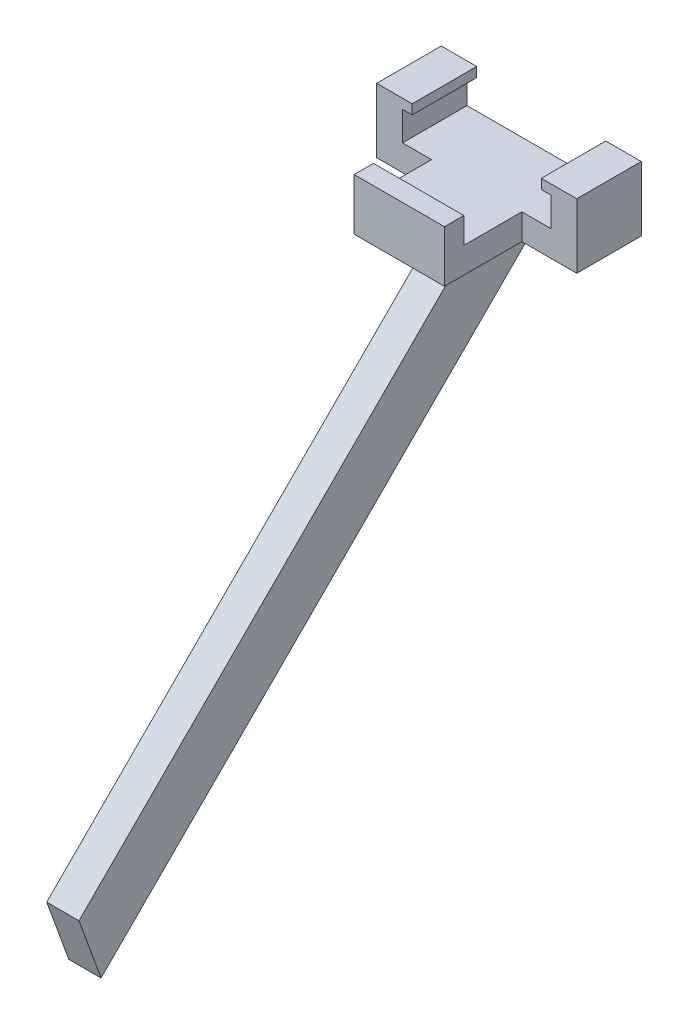
ISO-10303-21;
HEADER;
FILE_DESCRIPTION(('STEP AP214'),'2;1');
FILE_NAME('part.step','',(''),(''),'','','');
FILE_SCHEMA(('AUTOMOTIVE_DESIGN { 1 0 10303 214 1 1 1 1 }'));
ENDSEC;
DATA;
#1=APPLICATION_CONTEXT('core data for automotive mechanical design processes');
#2=APPLICATION_PROTOCOL_DEFINITION('international standard','automotive_design',2000,#1);
#3=PRODUCT_CONTEXT('',#1,'mechanical');
#4=PRODUCT('Part','Part','',(#3));
#5=PRODUCT_RELATED_PRODUCT_CATEGORY('part','',(#4));
#6=PRODUCT_DEFINITION_FORMATION('','',#4);
#7=PRODUCT_DEFINITION_CONTEXT('part definition',#1,'design');
#8=PRODUCT_DEFINITION('design','',#6,#7);
#9=PRODUCT_DEFINITION_SHAPE('','',#8);
#10=(LENGTH_UNIT() NAMED_UNIT(*) SI_UNIT(.MILLI.,.METRE.));
#11=(NAMED_UNIT(*) PLANE_ANGLE_UNIT() SI_UNIT($,.RADIAN.));
#12=(NAMED_UNIT(*) SI_UNIT($,.STERADIAN.) SOLID_ANGLE_UNIT());
#13=UNCERTAINTY_MEASURE_WITH_UNIT(LENGTH_MEASURE(1.E-05),#10,'distance_accuracy_value','');
#14=(GEOMETRIC_REPRESENTATION_CONTEXT(3) GLOBAL_UNCERTAINTY_ASSIGNED_CONTEXT((#13)) GLOBAL_UNIT_ASSIGNED_CONTEXT((#10,
#11,#12)) REPRESENTATION_CONTEXT('',''));
#15=CARTESIAN_POINT('',(0.,0.,0.));
#16=DIRECTION('',(0.,0.,1.));
#17=DIRECTION('',(1.,0.,0.));
#18=AXIS2_PLACEMENT_3D('',#15,#16,#17);
#19=CARTESIAN_POINT('',(0.,0.,10.));
#20=DIRECTION('',(0.,0.,1.));
#21=DIRECTION('',(1.,0.,0.));
#22=AXIS2_PLACEMENT_3D('',#19,#20,#21);
#23=PLANE('',#22);
#24=DIRECTION('',(1.,0.,0.));
#25=VECTOR('',#24,1.);
#26=CARTESIAN_POINT('',(0.,-9.,10.));
#27=LINE('',#26,#25);
#28=CARTESIAN_POINT('',(0.,-9.,10.));
#29=VERTEX_POINT('',#28);
#30=CARTESIAN_POINT('',(8.5,-9.,10.));
#31=VERTEX_POINT('',#30);
#32=EDGE_CURVE('E271',#29,#31,#27,.T.);
#33=ORIENTED_EDGE('',*,*,#32,.T.);
#34=DIRECTION('',(0.,-1.,0.));
#35=VECTOR('',#34,1.);
#36=CARTESIAN_POINT('',(8.5,-5.,10.));
#37=LINE('',#36,#35);
#38=CARTESIAN_POINT('',(8.5,-5.,10.));
#39=VERTEX_POINT('',#38);
#40=EDGE_CURVE('E58',#39,#31,#37,.T.);
#41=ORIENTED_EDGE('',*,*,#40,.F.);
#42=DIRECTION('',(-1.,0.,0.));
#43=VECTOR('',#42,1.);
#44=CARTESIAN_POINT('',(0.,-5.,10.));
#45=LINE('',#44,#43);
#46=CARTESIAN_POINT('',(4.,-5.,10.));
#47=VERTEX_POINT('',#46);
#48=EDGE_CURVE('E284',#39,#47,#45,.T.);
#49=ORIENTED_EDGE('',*,*,#48,.T.);
#50=DIRECTION('',(0.,1.,0.));
#51=VECTOR('',#50,1.);
#52=CARTESIAN_POINT('',(4.,0.,10.));
#53=LINE('',#52,#51);
#54=CARTESIAN_POINT('',(4.,-0.500000000000001,10.));
#55=VERTEX_POINT('',#54);
#56=EDGE_CURVE('E286',#47,#55,#53,.T.);
#57=ORIENTED_EDGE('',*,*,#56,.T.);
#58=DIRECTION('',(-1.,0.,0.));
#59=VECTOR('',#58,1.);
#60=CARTESIAN_POINT('',(0.,-0.500000000000001,10.));
#61=LINE('',#60,#59);
#62=CARTESIAN_POINT('',(5.5,-0.5,10.));
#63=VERTEX_POINT('',#62);
#64=EDGE_CURVE('E288',#63,#55,#61,.T.);
#65=ORIENTED_EDGE('',*,*,#64,.F.);
#66=DIRECTION('',(0.,-1.,0.));
#67=VECTOR('',#66,1.);
#68=CARTESIAN_POINT('',(5.5,0.,10.));
#69=LINE('',#68,#67);
#70=CARTESIAN_POINT('',(5.5,1.,10.));
#71=VERTEX_POINT('',#70);
#72=EDGE_CURVE('E291',#71,#63,#69,.T.);
#73=ORIENTED_EDGE('',*,*,#72,.F.);
#74=DIRECTION('',(1.,0.,0.));
#75=VECTOR('',#74,1.);
#76=CARTESIAN_POINT('',(0.,1.,10.));
#77=LINE('',#76,#75);
#78=CARTESIAN_POINT('',(0.,1.,10.));
#79=VERTEX_POINT('',#78);
#80=EDGE_CURVE('E294',#79,#71,#77,.T.);
#81=ORIENTED_EDGE('',*,*,#80,.F.);
#82=DIRECTION('',(0.,1.,0.));
#83=VECTOR('',#82,1.);
#84=CARTESIAN_POINT('',(0.,0.,10.));
#85=LINE('',#84,#83);
#86=EDGE_CURVE('E297',#29,#79,#85,.T.);
#87=ORIENTED_EDGE('',*,*,#86,.F.);
#88=EDGE_LOOP('',(#33,#41,#49,#57,#65,#73,#81,#87));
#89=FACE_BOUND('',#88,.T.);
#90=ADVANCED_FACE('F41',(#89),#23,.T.);
#91=CARTESIAN_POINT('',(27.,-5.,10.));
#92=VERTEX_POINT('',#91);
#93=CARTESIAN_POINT('',(22.5,-5.,10.));
#94=VERTEX_POINT('',#93);
#95=EDGE_CURVE('E66',#92,#94,#45,.T.);
#96=ORIENTED_EDGE('',*,*,#95,.T.);
#97=DIRECTION('',(0.,-1.,0.));
#98=VECTOR('',#97,1.);
#99=CARTESIAN_POINT('',(22.5,-5.,10.));
#100=LINE('',#99,#98);
#101=CARTESIAN_POINT('',(22.5,-9.,10.));
#102=VERTEX_POINT('',#101);
#103=EDGE_CURVE('E237',#94,#102,#100,.T.);
#104=ORIENTED_EDGE('',*,*,#103,.T.);
#105=CARTESIAN_POINT('',(31.,-9.,10.));
#106=VERTEX_POINT('',#105);
#107=EDGE_CURVE('E274',#102,#106,#27,.T.);
#108=ORIENTED_EDGE('',*,*,#107,.T.);
#109=DIRECTION('',(0.,1.,0.));
#110=VECTOR('',#109,1.);
#111=CARTESIAN_POINT('',(31.,0.,10.));
#112=LINE('',#111,#110);
#113=CARTESIAN_POINT('',(31.,1.,10.));
#114=VERTEX_POINT('',#113);
#115=EDGE_CURVE('E273',#106,#114,#112,.T.);
#116=ORIENTED_EDGE('',*,*,#115,.T.);
#117=DIRECTION('',(-1.,0.,0.));
#118=VECTOR('',#117,1.);
#119=CARTESIAN_POINT('',(0.,1.,10.));
#120=LINE('',#119,#118);
#121=CARTESIAN_POINT('',(25.5,1.,10.));
#122=VERTEX_POINT('',#121);
#123=EDGE_CURVE('E276',#114,#122,#120,.T.);
#124=ORIENTED_EDGE('',*,*,#123,.T.);
#125=DIRECTION('',(0.,-1.,0.));
#126=VECTOR('',#125,1.);
#127=CARTESIAN_POINT('',(25.5,0.,10.));
#128=LINE('',#127,#126);
#129=CARTESIAN_POINT('',(25.5,-0.5,10.));
#130=VERTEX_POINT('',#129);
#131=EDGE_CURVE('E278',#122,#130,#128,.T.);
#132=ORIENTED_EDGE('',*,*,#131,.T.);
#133=DIRECTION('',(1.,0.,0.));
#134=VECTOR('',#133,1.);
#135=CARTESIAN_POINT('',(0.,-0.499999999999997,10.));
#136=LINE('',#135,#134);
#137=CARTESIAN_POINT('',(27.,-0.500000000000001,10.));
#138=VERTEX_POINT('',#137);
#139=EDGE_CURVE('E280',#130,#138,#136,.T.);
#140=ORIENTED_EDGE('',*,*,#139,.T.);
#141=DIRECTION('',(0.,-1.,0.));
#142=VECTOR('',#141,1.);
#143=CARTESIAN_POINT('',(27.,0.,10.));
#144=LINE('',#143,#142);
#145=EDGE_CURVE('E282',#138,#92,#144,.T.);
#146=ORIENTED_EDGE('',*,*,#145,.T.);
#147=EDGE_LOOP('',(#96,#104,#108,#116,#124,#132,#140,#146));
#148=FACE_BOUND('',#147,.T.);
#149=ADVANCED_FACE('F380',(#148),#23,.T.);
#150=CARTESIAN_POINT('',(0.,-9.,10.));
#151=DIRECTION('',(0.,1.,0.));
#152=DIRECTION('',(0.,0.,1.));
#153=AXIS2_PLACEMENT_3D('',#150,#151,#152);
#154=PLANE('',#153);
#155=ORIENTED_EDGE('',*,*,#107,.F.);
#156=DIRECTION('',(0.,0.,-1.));
#157=VECTOR('',#156,1.);
#158=CARTESIAN_POINT('',(22.5,-9.,19.));
#159=LINE('',#158,#157);
#160=CARTESIAN_POINT('',(22.5,-9.,22.));
#161=VERTEX_POINT('',#160);
#162=EDGE_CURVE('E200',#161,#102,#159,.T.);
#163=ORIENTED_EDGE('',*,*,#162,.F.);
#164=DIRECTION('',(1.,0.,0.));
#165=VECTOR('',#164,1.);
#166=CARTESIAN_POINT('',(8.5,-9.,22.));
#167=LINE('',#166,#165);
#168=CARTESIAN_POINT('',(8.5,-9.,22.));
#169=VERTEX_POINT('',#168);
#170=EDGE_CURVE('E204',#169,#161,#167,.T.);
#171=ORIENTED_EDGE('',*,*,#170,.F.);
#172=DIRECTION('',(0.,0.,1.));
#173=VECTOR('',#172,1.);
#174=CARTESIAN_POINT('',(8.5,-9.,10.));
#175=LINE('',#174,#173);
#176=EDGE_CURVE('E191',#31,#169,#175,.T.);
#177=ORIENTED_EDGE('',*,*,#176,.F.);
#178=ORIENTED_EDGE('',*,*,#32,.F.);
#179=DIRECTION('',(0.,0.,-1.));
#180=VECTOR('',#179,1.);
#181=CARTESIAN_POINT('',(0.,-9.,10.));
#182=LINE('',#181,#180);
#183=CARTESIAN_POINT('',(0.,-9.,0.));
#184=VERTEX_POINT('',#183);
#185=EDGE_CURVE('E300',#29,#184,#182,.T.);
#186=ORIENTED_EDGE('',*,*,#185,.T.);
#187=DIRECTION('',(1.,0.,0.));
#188=VECTOR('',#187,1.);
#189=CARTESIAN_POINT('',(0.,-9.,0.));
#190=LINE('',#189,#188);
#191=CARTESIAN_POINT('',(13.,-9.,0.));
#192=VERTEX_POINT('',#191);
#193=EDGE_CURVE('E301',#184,#192,#190,.T.);
#194=ORIENTED_EDGE('',*,*,#193,.T.);
#195=DIRECTION('',(0.,0.,-1.));
#196=VECTOR('',#195,1.);
#197=CARTESIAN_POINT('',(13.,-9.,0.));
#198=LINE('',#197,#196);
#199=CARTESIAN_POINT('',(13.,-9.,12.8171276411148));
#200=VERTEX_POINT('',#199);
#201=EDGE_CURVE('E50',#200,#192,#198,.T.);
#202=ORIENTED_EDGE('',*,*,#201,.F.);
#203=DIRECTION('',(1.,0.,0.));
#204=VECTOR('',#203,1.);
#205=CARTESIAN_POINT('',(13.,-9.,12.8171276411148));
#206=LINE('',#205,#204);
#207=CARTESIAN_POINT('',(18.,-9.,12.8171276411148));
#208=VERTEX_POINT('',#207);
#209=EDGE_CURVE('E252',#200,#208,#206,.T.);
#210=ORIENTED_EDGE('',*,*,#209,.T.);
#211=DIRECTION('',(0.,0.,-1.));
#212=VECTOR('',#211,1.);
#213=CARTESIAN_POINT('',(18.,-9.,0.));
#214=LINE('',#213,#212);
#215=CARTESIAN_POINT('',(18.,-9.,0.));
#216=VERTEX_POINT('',#215);
#217=EDGE_CURVE('E11',#208,#216,#214,.T.);
#218=ORIENTED_EDGE('',*,*,#217,.T.);
#219=CARTESIAN_POINT('',(31.,-9.,0.));
#220=VERTEX_POINT('',#219);
#221=EDGE_CURVE('E270',#216,#220,#190,.T.);
#222=ORIENTED_EDGE('',*,*,#221,.T.);
#223=DIRECTION('',(0.,0.,-1.));
#224=VECTOR('',#223,1.);
#225=CARTESIAN_POINT('',(31.,-9.,10.));
#226=LINE('',#225,#224);
#227=EDGE_CURVE('E45',#106,#220,#226,.T.);
#228=ORIENTED_EDGE('',*,*,#227,.F.);
#229=EDGE_LOOP('',(#155,#163,#171,#177,#178,#186,#194,#202,#210,#218,#222,#228));
#230=FACE_BOUND('',#229,.T.);
#231=ADVANCED_FACE('F43',(#230),#154,.F.);
#232=CARTESIAN_POINT('',(31.,0.,10.));
#233=DIRECTION('',(-1.,0.,0.));
#234=DIRECTION('',(0.,-1.,0.));
#235=AXIS2_PLACEMENT_3D('',#232,#233,#234);
#236=PLANE('',#235);
#237=DIRECTION('',(0.,1.,0.));
#238=VECTOR('',#237,1.);
#239=CARTESIAN_POINT('',(31.,0.,0.));
#240=LINE('',#239,#238);
#241=CARTESIAN_POINT('',(31.,1.,0.));
#242=VERTEX_POINT('',#241);
#243=EDGE_CURVE('E303',#220,#242,#240,.T.);
#244=ORIENTED_EDGE('',*,*,#243,.T.);
#245=DIRECTION('',(0.,0.,-1.));
#246=VECTOR('',#245,1.);
#247=CARTESIAN_POINT('',(31.,1.,10.));
#248=LINE('',#247,#246);
#249=EDGE_CURVE('E353',#114,#242,#248,.T.);
#250=ORIENTED_EDGE('',*,*,#249,.F.);
#251=ORIENTED_EDGE('',*,*,#115,.F.);
#252=ORIENTED_EDGE('',*,*,#227,.T.);
#253=EDGE_LOOP('',(#244,#250,#251,#252));
#254=FACE_BOUND('',#253,.T.);
#255=ADVANCED_FACE('F363',(#254),#236,.F.);
#256=CARTESIAN_POINT('',(0.,1.,10.));
#257=DIRECTION('',(0.,-1.,0.));
#258=DIRECTION('',(0.,0.,-1.));
#259=AXIS2_PLACEMENT_3D('',#256,#257,#258);
#260=PLANE('',#259);
#261=DIRECTION('',(-1.,0.,0.));
#262=VECTOR('',#261,1.);
#263=CARTESIAN_POINT('',(0.,1.,0.));
#264=LINE('',#263,#262);
#265=CARTESIAN_POINT('',(25.5,1.,0.));
#266=VERTEX_POINT('',#265);
#267=EDGE_CURVE('E305',#242,#266,#264,.T.);
#268=ORIENTED_EDGE('',*,*,#267,.T.);
#269=DIRECTION('',(0.,0.,-1.));
#270=VECTOR('',#269,1.);
#271=CARTESIAN_POINT('',(25.5,1.,10.));
#272=LINE('',#271,#270);
#273=EDGE_CURVE('E351',#122,#266,#272,.T.);
#274=ORIENTED_EDGE('',*,*,#273,.F.);
#275=ORIENTED_EDGE('',*,*,#123,.F.);
#276=ORIENTED_EDGE('',*,*,#249,.T.);
#277=EDGE_LOOP('',(#268,#274,#275,#276));
#278=FACE_BOUND('',#277,.T.);
#279=ADVANCED_FACE('F374',(#278),#260,.F.);
#280=CARTESIAN_POINT('',(25.5,0.,10.));
#281=DIRECTION('',(1.,0.,0.));
#282=DIRECTION('',(0.,0.,-1.));
#283=AXIS2_PLACEMENT_3D('',#280,#281,#282);
#284=PLANE('',#283);
#285=DIRECTION('',(0.,-1.,0.));
#286=VECTOR('',#285,1.);
#287=CARTESIAN_POINT('',(25.5,0.,0.));
#288=LINE('',#287,#286);
#289=CARTESIAN_POINT('',(25.5,-0.5,0.));
#290=VERTEX_POINT('',#289);
#291=EDGE_CURVE('E307',#266,#290,#288,.T.);
#292=ORIENTED_EDGE('',*,*,#291,.T.);
#293=DIRECTION('',(0.,0.,-1.));
#294=VECTOR('',#293,1.);
#295=CARTESIAN_POINT('',(25.5,-0.5,10.));
#296=LINE('',#295,#294);
#297=EDGE_CURVE('E348',#130,#290,#296,.T.);
#298=ORIENTED_EDGE('',*,*,#297,.F.);
#299=ORIENTED_EDGE('',*,*,#131,.F.);
#300=ORIENTED_EDGE('',*,*,#273,.T.);
#301=EDGE_LOOP('',(#292,#298,#299,#300));
#302=FACE_BOUND('',#301,.T.);
#303=ADVANCED_FACE('F377',(#302),#284,.F.);
#304=CARTESIAN_POINT('',(0.,-0.499999999999997,10.));
#305=DIRECTION('',(0.,1.,0.));
#306=DIRECTION('',(-1.,0.,0.));
#307=AXIS2_PLACEMENT_3D('',#304,#305,#306);
#308=PLANE('',#307);
#309=DIRECTION('',(1.,0.,0.));
#310=VECTOR('',#309,1.);
#311=CARTESIAN_POINT('',(0.,-0.499999999999997,0.));
#312=LINE('',#311,#310);
#313=CARTESIAN_POINT('',(27.,-0.500000000000001,0.));
#314=VERTEX_POINT('',#313);
#315=EDGE_CURVE('E309',#290,#314,#312,.T.);
#316=ORIENTED_EDGE('',*,*,#315,.T.);
#317=DIRECTION('',(0.,0.,-1.));
#318=VECTOR('',#317,1.);
#319=CARTESIAN_POINT('',(27.,-0.500000000000001,10.));
#320=LINE('',#319,#318);
#321=EDGE_CURVE('E345',#138,#314,#320,.T.);
#322=ORIENTED_EDGE('',*,*,#321,.F.);
#323=ORIENTED_EDGE('',*,*,#139,.F.);
#324=ORIENTED_EDGE('',*,*,#297,.T.);
#325=EDGE_LOOP('',(#316,#322,#323,#324));
#326=FACE_BOUND('',#325,.T.);
#327=ADVANCED_FACE('F469',(#326),#308,.F.);
#328=CARTESIAN_POINT('',(27.,0.,10.));
#329=DIRECTION('',(1.,0.,0.));
#330=DIRECTION('',(0.,1.,0.));
#331=AXIS2_PLACEMENT_3D('',#328,#329,#330);
#332=PLANE('',#331);
#333=DIRECTION('',(0.,-1.,0.));
#334=VECTOR('',#333,1.);
#335=CARTESIAN_POINT('',(27.,0.,0.));
#336=LINE('',#335,#334);
#337=CARTESIAN_POINT('',(27.,-5.,0.));
#338=VERTEX_POINT('',#337);
#339=EDGE_CURVE('E311',#314,#338,#336,.T.);
#340=ORIENTED_EDGE('',*,*,#339,.T.);
#341=DIRECTION('',(0.,0.,-1.));
#342=VECTOR('',#341,1.);
#343=CARTESIAN_POINT('',(27.,-5.,10.));
#344=LINE('',#343,#342);
#345=EDGE_CURVE('E342',#92,#338,#344,.T.);
#346=ORIENTED_EDGE('',*,*,#345,.F.);
#347=ORIENTED_EDGE('',*,*,#145,.F.);
#348=ORIENTED_EDGE('',*,*,#321,.T.);
#349=EDGE_LOOP('',(#340,#346,#347,#348));
#350=FACE_BOUND('',#349,.T.);
#351=ADVANCED_FACE('F466',(#350),#332,.F.);
#352=CARTESIAN_POINT('',(0.,-5.,10.));
#353=DIRECTION('',(0.,-1.,0.));
#354=DIRECTION('',(1.,0.,0.));
#355=AXIS2_PLACEMENT_3D('',#352,#353,#354);
#356=PLANE('',#355);
#357=DIRECTION('',(-1.,0.,0.));
#358=VECTOR('',#357,1.);
#359=CARTESIAN_POINT('',(0.,-5.,0.));
#360=LINE('',#359,#358);
#361=CARTESIAN_POINT('',(4.,-5.,0.));
#362=VERTEX_POINT('',#361);
#363=EDGE_CURVE('E313',#338,#362,#360,.T.);
#364=ORIENTED_EDGE('',*,*,#363,.T.);
#365=DIRECTION('',(0.,0.,-1.));
#366=VECTOR('',#365,1.);
#367=CARTESIAN_POINT('',(4.,-5.,10.));
#368=LINE('',#367,#366);
#369=EDGE_CURVE('E339',#47,#362,#368,.T.);
#370=ORIENTED_EDGE('',*,*,#369,.F.);
#371=ORIENTED_EDGE('',*,*,#48,.F.);
#372=DIRECTION('',(0.,0.,1.));
#373=VECTOR('',#372,1.);
#374=CARTESIAN_POINT('',(8.5,-5.,10.));
#375=LINE('',#374,#373);
#376=CARTESIAN_POINT('',(8.5,-5.,19.));
#377=VERTEX_POINT('',#376);
#378=EDGE_CURVE('E230',#39,#377,#375,.T.);
#379=ORIENTED_EDGE('',*,*,#378,.T.);
#380=DIRECTION('',(1.,0.,0.));
#381=VECTOR('',#380,1.);
#382=CARTESIAN_POINT('',(8.5,-5.,19.));
#383=LINE('',#382,#381);
#384=CARTESIAN_POINT('',(22.5,-5.,19.));
#385=VERTEX_POINT('',#384);
#386=EDGE_CURVE('E233',#377,#385,#383,.T.);
#387=ORIENTED_EDGE('',*,*,#386,.T.);
#388=DIRECTION('',(0.,0.,-1.));
#389=VECTOR('',#388,1.);
#390=CARTESIAN_POINT('',(22.5,-5.,19.));
#391=LINE('',#390,#389);
#392=EDGE_CURVE('E236',#385,#94,#391,.T.);
#393=ORIENTED_EDGE('',*,*,#392,.T.);
#394=ORIENTED_EDGE('',*,*,#95,.F.);
#395=ORIENTED_EDGE('',*,*,#345,.T.);
#396=EDGE_LOOP('',(#364,#370,#371,#379,#387,#393,#394,#395));
#397=FACE_BOUND('',#396,.T.);
#398=ADVANCED_FACE('F394',(#397),#356,.F.);
#399=CARTESIAN_POINT('',(4.,0.,10.));
#400=DIRECTION('',(-1.,0.,0.));
#401=DIRECTION('',(0.,0.,1.));
#402=AXIS2_PLACEMENT_3D('',#399,#400,#401);
#403=PLANE('',#402);
#404=DIRECTION('',(0.,1.,0.));
#405=VECTOR('',#404,1.);
#406=CARTESIAN_POINT('',(4.,0.,0.));
#407=LINE('',#406,#405);
#408=CARTESIAN_POINT('',(4.,-0.500000000000001,0.));
#409=VERTEX_POINT('',#408);
#410=EDGE_CURVE('E315',#362,#409,#407,.T.);
#411=ORIENTED_EDGE('',*,*,#410,.T.);
#412=DIRECTION('',(0.,0.,-1.));
#413=VECTOR('',#412,1.);
#414=CARTESIAN_POINT('',(4.,-0.500000000000001,10.));
#415=LINE('',#414,#413);
#416=EDGE_CURVE('E337',#55,#409,#415,.T.);
#417=ORIENTED_EDGE('',*,*,#416,.F.);
#418=ORIENTED_EDGE('',*,*,#56,.F.);
#419=ORIENTED_EDGE('',*,*,#369,.T.);
#420=EDGE_LOOP('',(#411,#417,#418,#419));
#421=FACE_BOUND('',#420,.T.);
#422=ADVANCED_FACE('F401',(#421),#403,.F.);
#423=CARTESIAN_POINT('',(0.,-0.500000000000001,10.));
#424=DIRECTION('',(0.,-1.,0.));
#425=DIRECTION('',(1.,0.,0.));
#426=AXIS2_PLACEMENT_3D('',#423,#424,#425);
#427=PLANE('',#426);
#428=DIRECTION('',(-1.,0.,0.));
#429=VECTOR('',#428,1.);
#430=CARTESIAN_POINT('',(0.,-0.500000000000001,0.));
#431=LINE('',#430,#429);
#432=CARTESIAN_POINT('',(5.5,-0.5,0.));
#433=VERTEX_POINT('',#432);
#434=EDGE_CURVE('E318',#433,#409,#431,.T.);
#435=ORIENTED_EDGE('',*,*,#434,.F.);
#436=DIRECTION('',(0.,0.,-1.));
#437=VECTOR('',#436,1.);
#438=CARTESIAN_POINT('',(5.5,-0.5,10.));
#439=LINE('',#438,#437);
#440=EDGE_CURVE('E335',#63,#433,#439,.T.);
#441=ORIENTED_EDGE('',*,*,#440,.F.);
#442=ORIENTED_EDGE('',*,*,#64,.T.);
#443=ORIENTED_EDGE('',*,*,#416,.T.);
#444=EDGE_LOOP('',(#435,#441,#442,#443));
#445=FACE_BOUND('',#444,.T.);
#446=ADVANCED_FACE('F405',(#445),#427,.T.);
#447=CARTESIAN_POINT('',(5.5,0.,10.));
#448=DIRECTION('',(1.,0.,0.));
#449=DIRECTION('',(0.,1.,0.));
#450=AXIS2_PLACEMENT_3D('',#447,#448,#449);
#451=PLANE('',#450);
#452=DIRECTION('',(0.,-1.,0.));
#453=VECTOR('',#452,1.);
#454=CARTESIAN_POINT('',(5.5,0.,0.));
#455=LINE('',#454,#453);
#456=CARTESIAN_POINT('',(5.5,1.,0.));
#457=VERTEX_POINT('',#456);
#458=EDGE_CURVE('E321',#457,#433,#455,.T.);
#459=ORIENTED_EDGE('',*,*,#458,.F.);
#460=DIRECTION('',(0.,0.,-1.));
#461=VECTOR('',#460,1.);
#462=CARTESIAN_POINT('',(5.5,1.,10.));
#463=LINE('',#462,#461);
#464=EDGE_CURVE('E333',#71,#457,#463,.T.);
#465=ORIENTED_EDGE('',*,*,#464,.F.);
#466=ORIENTED_EDGE('',*,*,#72,.T.);
#467=ORIENTED_EDGE('',*,*,#440,.T.);
#468=EDGE_LOOP('',(#459,#465,#466,#467));
#469=FACE_BOUND('',#468,.T.);
#470=ADVANCED_FACE('F408',(#469),#451,.T.);
#471=CARTESIAN_POINT('',(0.,1.,10.));
#472=DIRECTION('',(0.,1.,0.));
#473=DIRECTION('',(0.,0.,1.));
#474=AXIS2_PLACEMENT_3D('',#471,#472,#473);
#475=PLANE('',#474);
#476=DIRECTION('',(1.,0.,0.));
#477=VECTOR('',#476,1.);
#478=CARTESIAN_POINT('',(0.,1.,0.));
#479=LINE('',#478,#477);
#480=CARTESIAN_POINT('',(0.,1.,0.));
#481=VERTEX_POINT('',#480);
#482=EDGE_CURVE('E324',#481,#457,#479,.T.);
#483=ORIENTED_EDGE('',*,*,#482,.F.);
#484=DIRECTION('',(0.,0.,-1.));
#485=VECTOR('',#484,1.);
#486=CARTESIAN_POINT('',(0.,1.,10.));
#487=LINE('',#486,#485);
#488=EDGE_CURVE('E331',#79,#481,#487,.T.);
#489=ORIENTED_EDGE('',*,*,#488,.F.);
#490=ORIENTED_EDGE('',*,*,#80,.T.);
#491=ORIENTED_EDGE('',*,*,#464,.T.);
#492=EDGE_LOOP('',(#483,#489,#490,#491));
#493=FACE_BOUND('',#492,.T.);
#494=ADVANCED_FACE('F413',(#493),#475,.T.);
#495=CARTESIAN_POINT('',(0.,0.,10.));
#496=DIRECTION('',(-1.,0.,0.));
#497=DIRECTION('',(0.,0.,1.));
#498=AXIS2_PLACEMENT_3D('',#495,#496,#497);
#499=PLANE('',#498);
#500=DIRECTION('',(0.,1.,0.));
#501=VECTOR('',#500,1.);
#502=CARTESIAN_POINT('',(0.,0.,0.));
#503=LINE('',#502,#501);
#504=EDGE_CURVE('E327',#184,#481,#503,.T.);
#505=ORIENTED_EDGE('',*,*,#504,.F.);
#506=ORIENTED_EDGE('',*,*,#185,.F.);
#507=ORIENTED_EDGE('',*,*,#86,.T.);
#508=ORIENTED_EDGE('',*,*,#488,.T.);
#509=EDGE_LOOP('',(#505,#506,#507,#508));
#510=FACE_BOUND('',#509,.T.);
#511=ADVANCED_FACE('F416',(#510),#499,.T.);
#512=CARTESIAN_POINT('',(0.,0.,0.));
#513=DIRECTION('',(0.,0.,1.));
#514=DIRECTION('',(1.,0.,0.));
#515=AXIS2_PLACEMENT_3D('',#512,#513,#514);
#516=PLANE('',#515);
#517=ORIENTED_EDGE('',*,*,#193,.F.);
#518=ORIENTED_EDGE('',*,*,#504,.T.);
#519=ORIENTED_EDGE('',*,*,#482,.T.);
#520=ORIENTED_EDGE('',*,*,#458,.T.);
#521=ORIENTED_EDGE('',*,*,#434,.T.);
#522=ORIENTED_EDGE('',*,*,#410,.F.);
#523=ORIENTED_EDGE('',*,*,#363,.F.);
#524=ORIENTED_EDGE('',*,*,#339,.F.);
#525=ORIENTED_EDGE('',*,*,#315,.F.);
#526=ORIENTED_EDGE('',*,*,#291,.F.);
#527=ORIENTED_EDGE('',*,*,#267,.F.);
#528=ORIENTED_EDGE('',*,*,#243,.F.);
#529=ORIENTED_EDGE('',*,*,#221,.F.);
#530=DIRECTION('',(1.,0.,0.));
#531=VECTOR('',#530,1.);
#532=CARTESIAN_POINT('',(13.,-9.,0.));
#533=LINE('',#532,#531);
#534=EDGE_CURVE('E267',#192,#216,#533,.T.);
#535=ORIENTED_EDGE('',*,*,#534,.F.);
#536=EDGE_LOOP('',(#517,#518,#519,#520,#521,#522,#523,#524,#525,#526,#527,#528,#529,#535));
#537=FACE_BOUND('',#536,.T.);
#538=ADVANCED_FACE('F370',(#537),#516,.F.);
#539=CARTESIAN_POINT('',(13.,-9.,0.));
#540=DIRECTION('',(0.,0.707106781186544,0.707106781186551));
#541=DIRECTION('',(0.,-0.707106781186551,0.707106781186544));
#542=AXIS2_PLACEMENT_3D('',#539,#540,#541);
#543=PLANE('',#542);
#544=DIRECTION('',(0.,-0.707106781186551,0.707106781186544));
#545=VECTOR('',#544,1.);
#546=CARTESIAN_POINT('',(18.,-9.,0.));
#547=LINE('',#546,#545);
#548=CARTESIAN_POINT('',(18.,-79.7106781186551,70.7106781186544));
#549=VERTEX_POINT('',#548);
#550=EDGE_CURVE('E242',#216,#549,#547,.T.);
#551=ORIENTED_EDGE('',*,*,#550,.T.);
#552=DIRECTION('',(1.,0.,0.));
#553=VECTOR('',#552,1.);
#554=CARTESIAN_POINT('',(13.,-79.7106781186551,70.7106781186544));
#555=LINE('',#554,#553);
#556=CARTESIAN_POINT('',(13.,-79.7106781186551,70.7106781186544));
#557=VERTEX_POINT('',#556);
#558=EDGE_CURVE('E264',#557,#549,#555,.T.);
#559=ORIENTED_EDGE('',*,*,#558,.F.);
#560=DIRECTION('',(0.,-0.707106781186551,0.707106781186544));
#561=VECTOR('',#560,1.);
#562=CARTESIAN_POINT('',(13.,-9.,0.));
#563=LINE('',#562,#561);
#564=EDGE_CURVE('E245',#192,#557,#563,.T.);
#565=ORIENTED_EDGE('',*,*,#564,.F.);
#566=ORIENTED_EDGE('',*,*,#534,.T.);
#567=EDGE_LOOP('',(#551,#559,#565,#566));
#568=FACE_BOUND('',#567,.T.);
#569=ADVANCED_FACE('F424',(#568),#543,.F.);
#570=CARTESIAN_POINT('',(13.,-79.7106781186551,70.7106781186544));
#571=DIRECTION('',(0.,0.342020143325664,-0.93969262078591));
#572=DIRECTION('',(0.,0.93969262078591,0.342020143325664));
#573=AXIS2_PLACEMENT_3D('',#570,#571,#572);
#574=PLANE('',#573);
#575=DIRECTION('',(0.,0.93969262078591,0.342020143325664));
#576=VECTOR('',#575,1.);
#577=CARTESIAN_POINT('',(18.,-79.7106781186551,70.7106781186544));
#578=LINE('',#577,#576);
#579=CARTESIAN_POINT('',(18.,-70.313751910796,74.130879551911));
#580=VERTEX_POINT('',#579);
#581=EDGE_CURVE('E255',#549,#580,#578,.T.);
#582=ORIENTED_EDGE('',*,*,#581,.T.);
#583=DIRECTION('',(1.,0.,0.));
#584=VECTOR('',#583,1.);
#585=CARTESIAN_POINT('',(13.,-70.313751910796,74.130879551911));
#586=LINE('',#585,#584);
#587=CARTESIAN_POINT('',(13.,-70.313751910796,74.130879551911));
#588=VERTEX_POINT('',#587);
#589=EDGE_CURVE('E261',#588,#580,#586,.T.);
#590=ORIENTED_EDGE('',*,*,#589,.F.);
#591=DIRECTION('',(0.,0.93969262078591,0.342020143325664));
#592=VECTOR('',#591,1.);
#593=CARTESIAN_POINT('',(13.,-79.7106781186551,70.7106781186544));
#594=LINE('',#593,#592);
#595=EDGE_CURVE('E247',#557,#588,#594,.T.);
#596=ORIENTED_EDGE('',*,*,#595,.F.);
#597=ORIENTED_EDGE('',*,*,#558,.T.);
#598=EDGE_LOOP('',(#582,#590,#596,#597));
#599=FACE_BOUND('',#598,.T.);
#600=ADVANCED_FACE('F429',(#599),#574,.F.);
#601=CARTESIAN_POINT('',(13.,-70.313751910796,74.130879551911));
#602=DIRECTION('',(0.,-0.707106781186549,-0.707106781186546));
#603=DIRECTION('',(0.,0.707106781186546,-0.707106781186549));
#604=AXIS2_PLACEMENT_3D('',#601,#602,#603);
#605=PLANE('',#604);
#606=DIRECTION('',(0.,0.707106781186546,-0.707106781186549));
#607=VECTOR('',#606,1.);
#608=CARTESIAN_POINT('',(18.,-70.313751910796,74.130879551911));
#609=LINE('',#608,#607);
#610=EDGE_CURVE('E248',#580,#208,#609,.T.);
#611=ORIENTED_EDGE('',*,*,#610,.T.);
#612=ORIENTED_EDGE('',*,*,#209,.F.);
#613=DIRECTION('',(0.,0.707106781186546,-0.707106781186549));
#614=VECTOR('',#613,1.);
#615=CARTESIAN_POINT('',(13.,-70.313751910796,74.130879551911));
#616=LINE('',#615,#614);
#617=EDGE_CURVE('E250',#588,#200,#616,.T.);
#618=ORIENTED_EDGE('',*,*,#617,.F.);
#619=ORIENTED_EDGE('',*,*,#589,.T.);
#620=EDGE_LOOP('',(#611,#612,#618,#619));
#621=FACE_BOUND('',#620,.T.);
#622=ADVANCED_FACE('F432',(#621),#605,.F.);
#623=CARTESIAN_POINT('',(13.,0.,0.));
#624=DIRECTION('',(-1.,0.,0.));
#625=DIRECTION('',(0.,-1.,0.));
#626=AXIS2_PLACEMENT_3D('',#623,#624,#625);
#627=PLANE('',#626);
#628=ORIENTED_EDGE('',*,*,#617,.T.);
#629=ORIENTED_EDGE('',*,*,#201,.T.);
#630=ORIENTED_EDGE('',*,*,#564,.T.);
#631=ORIENTED_EDGE('',*,*,#595,.T.);
#632=EDGE_LOOP('',(#628,#629,#630,#631));
#633=FACE_BOUND('',#632,.T.);
#634=ADVANCED_FACE('F420',(#633),#627,.T.);
#635=CARTESIAN_POINT('',(18.,0.,0.));
#636=DIRECTION('',(-1.,0.,0.));
#637=DIRECTION('',(0.,-1.,0.));
#638=AXIS2_PLACEMENT_3D('',#635,#636,#637);
#639=PLANE('',#638);
#640=ORIENTED_EDGE('',*,*,#217,.F.);
#641=ORIENTED_EDGE('',*,*,#610,.F.);
#642=ORIENTED_EDGE('',*,*,#581,.F.);
#643=ORIENTED_EDGE('',*,*,#550,.F.);
#644=EDGE_LOOP('',(#640,#641,#642,#643));
#645=FACE_BOUND('',#644,.T.);
#646=ADVANCED_FACE('F434',(#645),#639,.F.);
#647=CARTESIAN_POINT('',(8.5,-5.,10.));
#648=DIRECTION('',(1.,0.,0.));
#649=DIRECTION('',(0.,0.,-1.));
#650=AXIS2_PLACEMENT_3D('',#647,#648,#649);
#651=PLANE('',#650);
#652=ORIENTED_EDGE('',*,*,#176,.T.);
#653=DIRECTION('',(0.,-1.,0.));
#654=VECTOR('',#653,1.);
#655=CARTESIAN_POINT('',(8.5,-9.,22.));
#656=LINE('',#655,#654);
#657=CARTESIAN_POINT('',(8.5,-0.999999999999999,22.));
#658=VERTEX_POINT('',#657);
#659=EDGE_CURVE('E196',#658,#169,#656,.T.);
#660=ORIENTED_EDGE('',*,*,#659,.F.);
#661=DIRECTION('',(0.,0.,-1.));
#662=VECTOR('',#661,1.);
#663=CARTESIAN_POINT('',(8.5,-0.999999999999999,22.));
#664=LINE('',#663,#662);
#665=CARTESIAN_POINT('',(8.5,-0.999999999999999,19.));
#666=VERTEX_POINT('',#665);
#667=EDGE_CURVE('E222',#658,#666,#664,.T.);
#668=ORIENTED_EDGE('',*,*,#667,.T.);
#669=DIRECTION('',(0.,-1.,0.));
#670=VECTOR('',#669,1.);
#671=CARTESIAN_POINT('',(8.5,-9.,19.));
#672=LINE('',#671,#670);
#673=EDGE_CURVE('E223',#666,#377,#672,.T.);
#674=ORIENTED_EDGE('',*,*,#673,.T.);
#675=ORIENTED_EDGE('',*,*,#378,.F.);
#676=ORIENTED_EDGE('',*,*,#40,.T.);
#677=EDGE_LOOP('',(#652,#660,#668,#674,#675,#676));
#678=FACE_BOUND('',#677,.T.);
#679=ADVANCED_FACE('F193',(#678),#651,.F.);
#680=CARTESIAN_POINT('',(22.5,-5.,19.));
#681=DIRECTION('',(-1.,0.,0.));
#682=DIRECTION('',(0.,-1.,0.));
#683=AXIS2_PLACEMENT_3D('',#680,#681,#682);
#684=PLANE('',#683);
#685=ORIENTED_EDGE('',*,*,#162,.T.);
#686=ORIENTED_EDGE('',*,*,#103,.F.);
#687=ORIENTED_EDGE('',*,*,#392,.F.);
#688=DIRECTION('',(0.,1.,0.));
#689=VECTOR('',#688,1.);
#690=CARTESIAN_POINT('',(22.5,-9.,19.));
#691=LINE('',#690,#689);
#692=CARTESIAN_POINT('',(22.5,-0.999999999999999,19.));
#693=VERTEX_POINT('',#692);
#694=EDGE_CURVE('E217',#385,#693,#691,.T.);
#695=ORIENTED_EDGE('',*,*,#694,.T.);
#696=DIRECTION('',(0.,0.,-1.));
#697=VECTOR('',#696,1.);
#698=CARTESIAN_POINT('',(22.5,-0.999999999999999,22.));
#699=LINE('',#698,#697);
#700=CARTESIAN_POINT('',(22.5,-0.999999999999999,22.));
#701=VERTEX_POINT('',#700);
#702=EDGE_CURVE('E201',#701,#693,#699,.T.);
#703=ORIENTED_EDGE('',*,*,#702,.F.);
#704=DIRECTION('',(0.,1.,0.));
#705=VECTOR('',#704,1.);
#706=CARTESIAN_POINT('',(22.5,-9.,22.));
#707=LINE('',#706,#705);
#708=EDGE_CURVE('E209',#161,#701,#707,.T.);
#709=ORIENTED_EDGE('',*,*,#708,.F.);
#710=EDGE_LOOP('',(#685,#686,#687,#695,#703,#709));
#711=FACE_BOUND('',#710,.T.);
#712=ADVANCED_FACE('F385',(#711),#684,.F.);
#713=CARTESIAN_POINT('',(0.,0.,19.));
#714=DIRECTION('',(0.,0.,-1.));
#715=DIRECTION('',(-1.,0.,0.));
#716=AXIS2_PLACEMENT_3D('',#713,#714,#715);
#717=PLANE('',#716);
#718=ORIENTED_EDGE('',*,*,#386,.F.);
#719=ORIENTED_EDGE('',*,*,#673,.F.);
#720=DIRECTION('',(-1.,0.,0.));
#721=VECTOR('',#720,1.);
#722=CARTESIAN_POINT('',(8.5,-0.999999999999999,19.));
#723=LINE('',#722,#721);
#724=EDGE_CURVE('E215',#693,#666,#723,.T.);
#725=ORIENTED_EDGE('',*,*,#724,.F.);
#726=ORIENTED_EDGE('',*,*,#694,.F.);
#727=EDGE_LOOP('',(#718,#719,#725,#726));
#728=FACE_BOUND('',#727,.T.);
#729=ADVANCED_FACE('F392',(#728),#717,.T.);
#730=CARTESIAN_POINT('',(8.5,-0.999999999999999,22.));
#731=DIRECTION('',(0.,-1.,0.));
#732=DIRECTION('',(0.,0.,-1.));
#733=AXIS2_PLACEMENT_3D('',#730,#731,#732);
#734=PLANE('',#733);
#735=ORIENTED_EDGE('',*,*,#724,.T.);
#736=ORIENTED_EDGE('',*,*,#667,.F.);
#737=DIRECTION('',(-1.,0.,0.));
#738=VECTOR('',#737,1.);
#739=CARTESIAN_POINT('',(8.5,-0.999999999999999,22.));
#740=LINE('',#739,#738);
#741=EDGE_CURVE('E213',#701,#658,#740,.T.);
#742=ORIENTED_EDGE('',*,*,#741,.F.);
#743=ORIENTED_EDGE('',*,*,#702,.T.);
#744=EDGE_LOOP('',(#735,#736,#742,#743));
#745=FACE_BOUND('',#744,.T.);
#746=ADVANCED_FACE('F389',(#745),#734,.F.);
#747=CARTESIAN_POINT('',(0.,0.,22.));
#748=DIRECTION('',(0.,0.,-1.));
#749=DIRECTION('',(-1.,0.,0.));
#750=AXIS2_PLACEMENT_3D('',#747,#748,#749);
#751=PLANE('',#750);
#752=ORIENTED_EDGE('',*,*,#659,.T.);
#753=ORIENTED_EDGE('',*,*,#170,.T.);
#754=ORIENTED_EDGE('',*,*,#708,.T.);
#755=ORIENTED_EDGE('',*,*,#741,.T.);
#756=EDGE_LOOP('',(#752,#753,#754,#755));
#757=FACE_BOUND('',#756,.T.);
#758=ADVANCED_FACE('F211',(#757),#751,.F.);
#759=CLOSED_SHELL('',(#90,#149,#231,#255,#279,#303,#327,#351,#398,#422,#446,#470,#494,#511,#538,
#569,#600,#622,#634,#646,#679,#712,#729,#746,#758));
#760=MANIFOLD_SOLID_BREP('B2',#759);
#761=ADVANCED_BREP_SHAPE_REPRESENTATION('',(#18,#760),#14);
#762=SHAPE_DEFINITION_REPRESENTATION(#9,#761);
ENDSEC;
END-ISO-10303-21;
